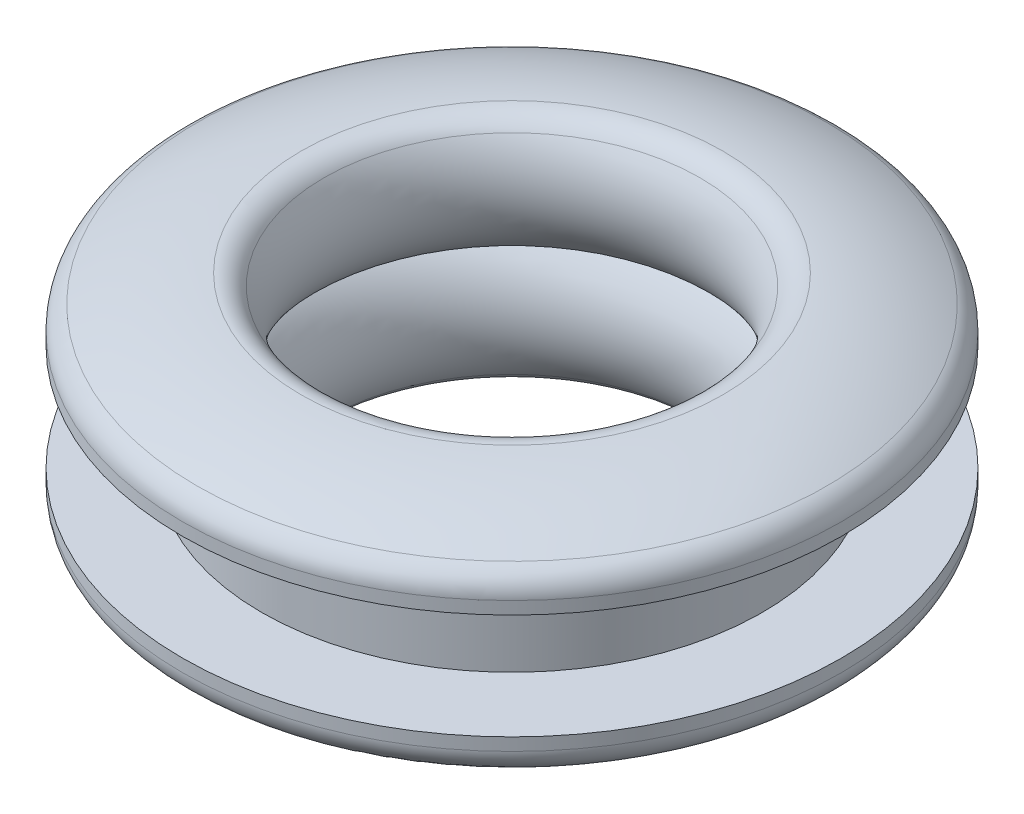
ISO-10303-21;
HEADER;
FILE_DESCRIPTION(('STEP AP214'),'2;1');
FILE_NAME('part.step','',(''),(''),'','','');
FILE_SCHEMA(('AUTOMOTIVE_DESIGN { 1 0 10303 214 1 1 1 1 }'));
ENDSEC;
DATA;
#1=APPLICATION_CONTEXT('core data for automotive mechanical design processes');
#2=APPLICATION_PROTOCOL_DEFINITION('international standard','automotive_design',2000,#1);
#3=PRODUCT_CONTEXT('',#1,'mechanical');
#4=PRODUCT('Part','Part','',(#3));
#5=PRODUCT_RELATED_PRODUCT_CATEGORY('part','',(#4));
#6=PRODUCT_DEFINITION_FORMATION('','',#4);
#7=PRODUCT_DEFINITION_CONTEXT('part definition',#1,'design');
#8=PRODUCT_DEFINITION('design','',#6,#7);
#9=PRODUCT_DEFINITION_SHAPE('','',#8);
#10=(LENGTH_UNIT() NAMED_UNIT(*) SI_UNIT(.MILLI.,.METRE.));
#11=(NAMED_UNIT(*) PLANE_ANGLE_UNIT() SI_UNIT($,.RADIAN.));
#12=(NAMED_UNIT(*) SI_UNIT($,.STERADIAN.) SOLID_ANGLE_UNIT());
#13=UNCERTAINTY_MEASURE_WITH_UNIT(LENGTH_MEASURE(1.E-05),#10,'distance_accuracy_value','');
#14=(GEOMETRIC_REPRESENTATION_CONTEXT(3) GLOBAL_UNCERTAINTY_ASSIGNED_CONTEXT((#13)) GLOBAL_UNIT_ASSIGNED_CONTEXT((#10,
#11,#12)) REPRESENTATION_CONTEXT('',''));
#15=CARTESIAN_POINT('',(0.,0.,0.));
#16=DIRECTION('',(0.,0.,1.));
#17=DIRECTION('',(1.,0.,0.));
#18=AXIS2_PLACEMENT_3D('',#15,#16,#17);
#19=CARTESIAN_POINT('',(-75.,-22.0833333333334,0.));
#20=DIRECTION('',(0.,1.,0.));
#21=DIRECTION('',(0.,0.,1.));
#22=AXIS2_PLACEMENT_3D('',#19,#20,#21);
#23=TOROIDAL_SURFACE('',#22,97.0833333333334,31.230549502406);
#24=CARTESIAN_POINT('',(-75.,-39.6890180135923,0.));
#25=DIRECTION('',(0.,1.,0.));
#26=DIRECTION('',(0.,0.,1.));
#27=AXIS2_PLACEMENT_3D('',#24,#25,#26);
#28=CIRCLE('',#27,71.2882351718313);
#29=CARTESIAN_POINT('',(-75.,-39.6890180135923,71.2882351718313));
#30=VERTEX_POINT('',#29);
#31=EDGE_CURVE('E50',#30,#30,#28,.F.);
#32=ORIENTED_EDGE('',*,*,#31,.T.);
#33=EDGE_LOOP('',(#32));
#34=FACE_BOUND('',#33,.T.);
#35=CARTESIAN_POINT('',(-75.,0.,0.));
#36=DIRECTION('',(0.,1.,0.));
#37=DIRECTION('',(0.,0.,1.));
#38=AXIS2_PLACEMENT_3D('',#35,#36,#37);
#39=CIRCLE('',#38,75.);
#40=CARTESIAN_POINT('',(-75.,0.,75.));
#41=VERTEX_POINT('',#40);
#42=EDGE_CURVE('E93',#41,#41,#39,.T.);
#43=ORIENTED_EDGE('',*,*,#42,.T.);
#44=EDGE_LOOP('',(#43));
#45=FACE_BOUND('',#44,.T.);
#46=ADVANCED_FACE('F37',(#34,#45),#23,.T.);
#47=CARTESIAN_POINT('',(-75.,55.8333333333332,0.));
#48=DIRECTION('',(0.,1.,0.));
#49=DIRECTION('',(0.,0.,1.));
#50=AXIS2_PLACEMENT_3D('',#47,#48,#49);
#51=DEGENERATE_TOROIDAL_SURFACE('',#50,75.,100.,.T.);
#52=CARTESIAN_POINT('',(-75.,-44.0389149851273,0.));
#53=DIRECTION('',(0.,1.,0.));
#54=DIRECTION('',(0.,0.,1.));
#55=AXIS2_PLACEMENT_3D('',#52,#53,#54);
#56=CIRCLE('',#55,80.0531194142546);
#57=CARTESIAN_POINT('',(-75.,-44.0389149851273,80.0531194142546));
#58=VERTEX_POINT('',#57);
#59=EDGE_CURVE('E55',#58,#58,#56,.T.);
#60=ORIENTED_EDGE('',*,*,#59,.T.);
#61=EDGE_LOOP('',(#60));
#62=FACE_BOUND('',#61,.T.);
#63=CARTESIAN_POINT('',(-75.,-33.7473083144284,0.));
#64=DIRECTION('',(0.,1.,0.));
#65=DIRECTION('',(0.,0.,1.));
#66=AXIS2_PLACEMENT_3D('',#63,#64,#65);
#67=CIRCLE('',#66,119.444444444444);
#68=CARTESIAN_POINT('',(-75.,-33.7473083144284,119.444444444444));
#69=VERTEX_POINT('',#68);
#70=EDGE_CURVE('E61',#69,#69,#67,.T.);
#71=ORIENTED_EDGE('',*,*,#70,.F.);
#72=EDGE_LOOP('',(#71));
#73=FACE_BOUND('',#72,.T.);
#74=ADVANCED_FACE('F114',(#62,#73),#51,.T.);
#75=CARTESIAN_POINT('',(-75.,-24.7892441496523,0.));
#76=DIRECTION('',(0.,1.,0.));
#77=DIRECTION('',(0.,0.,1.));
#78=AXIS2_PLACEMENT_3D('',#75,#76,#77);
#79=TOROIDAL_SURFACE('',#78,115.,10.);
#80=CARTESIAN_POINT('',(-75.,-24.7892441496523,0.));
#81=DIRECTION('',(0.,1.,0.));
#82=DIRECTION('',(0.,0.,1.));
#83=AXIS2_PLACEMENT_3D('',#80,#81,#82);
#84=CIRCLE('',#83,125.);
#85=CARTESIAN_POINT('',(-75.,-24.7892441496523,125.));
#86=VERTEX_POINT('',#85);
#87=EDGE_CURVE('E65',#86,#86,#84,.T.);
#88=ORIENTED_EDGE('',*,*,#87,.F.);
#89=EDGE_LOOP('',(#88));
#90=FACE_BOUND('',#89,.T.);
#91=ORIENTED_EDGE('',*,*,#70,.T.);
#92=EDGE_LOOP('',(#91));
#93=FACE_BOUND('',#92,.T.);
#94=ADVANCED_FACE('F120',(#90,#93),#79,.T.);
#95=CARTESIAN_POINT('',(-75.,0.,0.));
#96=DIRECTION('',(0.,1.,0.));
#97=DIRECTION('',(0.,0.,1.));
#98=AXIS2_PLACEMENT_3D('',#95,#96,#97);
#99=CYLINDRICAL_SURFACE('',#98,125.);
#100=CARTESIAN_POINT('',(-75.,-20.,0.));
#101=DIRECTION('',(0.,1.,0.));
#102=DIRECTION('',(0.,0.,1.));
#103=AXIS2_PLACEMENT_3D('',#100,#101,#102);
#104=CIRCLE('',#103,125.);
#105=CARTESIAN_POINT('',(-75.,-20.,125.));
#106=VERTEX_POINT('',#105);
#107=EDGE_CURVE('E69',#106,#106,#104,.T.);
#108=ORIENTED_EDGE('',*,*,#107,.F.);
#109=EDGE_LOOP('',(#108));
#110=FACE_BOUND('',#109,.T.);
#111=ORIENTED_EDGE('',*,*,#87,.T.);
#112=EDGE_LOOP('',(#111));
#113=FACE_BOUND('',#112,.T.);
#114=ADVANCED_FACE('F143',(#110,#113),#99,.T.);
#115=CARTESIAN_POINT('',(50.,-20.,0.));
#116=DIRECTION('',(0.,-1.,0.));
#117=DIRECTION('',(0.,0.,-1.));
#118=AXIS2_PLACEMENT_3D('',#115,#116,#117);
#119=PLANE('',#118);
#120=CARTESIAN_POINT('',(-75.,-20.,0.));
#121=DIRECTION('',(0.,1.,0.));
#122=DIRECTION('',(0.,0.,1.));
#123=AXIS2_PLACEMENT_3D('',#120,#121,#122);
#124=CIRCLE('',#123,95.);
#125=CARTESIAN_POINT('',(-75.,-20.,95.));
#126=VERTEX_POINT('',#125);
#127=EDGE_CURVE('E73',#126,#126,#124,.T.);
#128=ORIENTED_EDGE('',*,*,#127,.F.);
#129=EDGE_LOOP('',(#128));
#130=FACE_BOUND('',#129,.T.);
#131=ORIENTED_EDGE('',*,*,#107,.T.);
#132=EDGE_LOOP('',(#131));
#133=FACE_BOUND('',#132,.T.);
#134=ADVANCED_FACE('F110',(#130,#133),#119,.F.);
#135=CARTESIAN_POINT('',(-75.,0.,0.));
#136=DIRECTION('',(0.,1.,0.));
#137=DIRECTION('',(0.,0.,1.));
#138=AXIS2_PLACEMENT_3D('',#135,#136,#137);
#139=CYLINDRICAL_SURFACE('',#138,95.);
#140=ORIENTED_EDGE('',*,*,#127,.T.);
#141=EDGE_LOOP('',(#140));
#142=FACE_BOUND('',#141,.T.);
#143=CARTESIAN_POINT('',(-75.,20.,0.));
#144=DIRECTION('',(0.,1.,0.));
#145=DIRECTION('',(0.,0.,1.));
#146=AXIS2_PLACEMENT_3D('',#143,#144,#145);
#147=CIRCLE('',#146,95.);
#148=CARTESIAN_POINT('',(-75.,20.,95.));
#149=VERTEX_POINT('',#148);
#150=EDGE_CURVE('E89',#149,#149,#147,.T.);
#151=ORIENTED_EDGE('',*,*,#150,.F.);
#152=EDGE_LOOP('',(#151));
#153=FACE_BOUND('',#152,.T.);
#154=ADVANCED_FACE('F102',(#142,#153),#139,.T.);
#155=CARTESIAN_POINT('',(-75.,22.0833333333334,0.));
#156=DIRECTION('',(0.,-1.,0.));
#157=DIRECTION('',(0.,0.,1.));
#158=AXIS2_PLACEMENT_3D('',#155,#156,#157);
#159=TOROIDAL_SURFACE('',#158,97.0833333333334,31.230549502406);
#160=CARTESIAN_POINT('',(-75.,39.6890180135923,0.));
#161=DIRECTION('',(0.,-1.,0.));
#162=DIRECTION('',(0.,0.,-1.));
#163=AXIS2_PLACEMENT_3D('',#160,#161,#162);
#164=CIRCLE('',#163,71.2882351718313);
#165=CARTESIAN_POINT('',(-75.,39.6890180135923,-71.2882351718313));
#166=VERTEX_POINT('',#165);
#167=EDGE_CURVE('E45',#166,#166,#164,.F.);
#168=ORIENTED_EDGE('',*,*,#167,.T.);
#169=EDGE_LOOP('',(#168));
#170=FACE_BOUND('',#169,.T.);
#171=ORIENTED_EDGE('',*,*,#42,.F.);
#172=EDGE_LOOP('',(#171));
#173=FACE_BOUND('',#172,.T.);
#174=ADVANCED_FACE('F99',(#170,#173),#159,.T.);
#175=CARTESIAN_POINT('',(-75.,-55.8333333333332,0.));
#176=DIRECTION('',(0.,-1.,0.));
#177=DIRECTION('',(0.,0.,1.));
#178=AXIS2_PLACEMENT_3D('',#175,#176,#177);
#179=DEGENERATE_TOROIDAL_SURFACE('',#178,75.,100.,.T.);
#180=CARTESIAN_POINT('',(-75.,44.0389149851273,0.));
#181=DIRECTION('',(0.,-1.,0.));
#182=DIRECTION('',(0.,0.,-1.));
#183=AXIS2_PLACEMENT_3D('',#180,#181,#182);
#184=CIRCLE('',#183,80.0531194142546);
#185=CARTESIAN_POINT('',(-75.,44.0389149851273,-80.0531194142546));
#186=VERTEX_POINT('',#185);
#187=EDGE_CURVE('E10',#186,#186,#184,.T.);
#188=ORIENTED_EDGE('',*,*,#187,.T.);
#189=EDGE_LOOP('',(#188));
#190=FACE_BOUND('',#189,.T.);
#191=CARTESIAN_POINT('',(-75.,33.7473083144284,0.));
#192=DIRECTION('',(0.,1.,0.));
#193=DIRECTION('',(0.,0.,1.));
#194=AXIS2_PLACEMENT_3D('',#191,#192,#193);
#195=CIRCLE('',#194,119.444444444444);
#196=CARTESIAN_POINT('',(-75.,33.7473083144284,119.444444444444));
#197=VERTEX_POINT('',#196);
#198=EDGE_CURVE('E77',#197,#197,#195,.T.);
#199=ORIENTED_EDGE('',*,*,#198,.T.);
#200=EDGE_LOOP('',(#199));
#201=FACE_BOUND('',#200,.T.);
#202=ADVANCED_FACE('F101',(#190,#201),#179,.T.);
#203=CARTESIAN_POINT('',(-75.,24.7892441496523,0.));
#204=DIRECTION('',(0.,-1.,0.));
#205=DIRECTION('',(0.,0.,1.));
#206=AXIS2_PLACEMENT_3D('',#203,#204,#205);
#207=TOROIDAL_SURFACE('',#206,115.,10.);
#208=CARTESIAN_POINT('',(-75.,24.7892441496523,0.));
#209=DIRECTION('',(0.,1.,0.));
#210=DIRECTION('',(0.,0.,1.));
#211=AXIS2_PLACEMENT_3D('',#208,#209,#210);
#212=CIRCLE('',#211,125.);
#213=CARTESIAN_POINT('',(-75.,24.7892441496523,125.));
#214=VERTEX_POINT('',#213);
#215=EDGE_CURVE('E81',#214,#214,#212,.T.);
#216=ORIENTED_EDGE('',*,*,#215,.T.);
#217=EDGE_LOOP('',(#216));
#218=FACE_BOUND('',#217,.T.);
#219=ORIENTED_EDGE('',*,*,#198,.F.);
#220=EDGE_LOOP('',(#219));
#221=FACE_BOUND('',#220,.T.);
#222=ADVANCED_FACE('F108',(#218,#221),#207,.T.);
#223=CARTESIAN_POINT('',(-75.,0.,0.));
#224=DIRECTION('',(0.,-1.,0.));
#225=DIRECTION('',(0.,0.,1.));
#226=AXIS2_PLACEMENT_3D('',#223,#224,#225);
#227=CYLINDRICAL_SURFACE('',#226,125.);
#228=CARTESIAN_POINT('',(-75.,20.,0.));
#229=DIRECTION('',(0.,1.,0.));
#230=DIRECTION('',(0.,0.,1.));
#231=AXIS2_PLACEMENT_3D('',#228,#229,#230);
#232=CIRCLE('',#231,125.);
#233=CARTESIAN_POINT('',(-75.,20.,125.));
#234=VERTEX_POINT('',#233);
#235=EDGE_CURVE('E85',#234,#234,#232,.T.);
#236=ORIENTED_EDGE('',*,*,#235,.T.);
#237=EDGE_LOOP('',(#236));
#238=FACE_BOUND('',#237,.T.);
#239=ORIENTED_EDGE('',*,*,#215,.F.);
#240=EDGE_LOOP('',(#239));
#241=FACE_BOUND('',#240,.T.);
#242=ADVANCED_FACE('F133',(#238,#241),#227,.T.);
#243=CARTESIAN_POINT('',(50.,20.,0.));
#244=DIRECTION('',(0.,1.,0.));
#245=DIRECTION('',(0.,0.,-1.));
#246=AXIS2_PLACEMENT_3D('',#243,#244,#245);
#247=PLANE('',#246);
#248=ORIENTED_EDGE('',*,*,#150,.T.);
#249=EDGE_LOOP('',(#248));
#250=FACE_BOUND('',#249,.T.);
#251=ORIENTED_EDGE('',*,*,#235,.F.);
#252=EDGE_LOOP('',(#251));
#253=FACE_BOUND('',#252,.T.);
#254=ADVANCED_FACE('F126',(#250,#253),#247,.F.);
#255=CARTESIAN_POINT('',(-75.,-34.0516901532859,0.));
#256=DIRECTION('',(0.,-1.,0.));
#257=DIRECTION('',(0.,0.,-1.));
#258=AXIS2_PLACEMENT_3D('',#255,#256,#257);
#259=TOROIDAL_SURFACE('',#258,79.5478074728294,10.);
#260=ORIENTED_EDGE('',*,*,#31,.F.);
#261=EDGE_LOOP('',(#260));
#262=FACE_BOUND('',#261,.T.);
#263=ORIENTED_EDGE('',*,*,#59,.F.);
#264=EDGE_LOOP('',(#263));
#265=FACE_BOUND('',#264,.T.);
#266=ADVANCED_FACE('F124',(#262,#265),#259,.T.);
#267=CARTESIAN_POINT('',(-75.,34.0516901532859,0.));
#268=DIRECTION('',(0.,-1.,0.));
#269=DIRECTION('',(0.,0.,-1.));
#270=AXIS2_PLACEMENT_3D('',#267,#268,#269);
#271=TOROIDAL_SURFACE('',#270,79.5478074728294,10.);
#272=ORIENTED_EDGE('',*,*,#187,.F.);
#273=EDGE_LOOP('',(#272));
#274=FACE_BOUND('',#273,.T.);
#275=ORIENTED_EDGE('',*,*,#167,.F.);
#276=EDGE_LOOP('',(#275));
#277=FACE_BOUND('',#276,.T.);
#278=ADVANCED_FACE('F39',(#274,#277),#271,.T.);
#279=CLOSED_SHELL('',(#46,#74,#94,#114,#134,#154,#174,#202,#222,#242,#254,#266,#278));
#280=MANIFOLD_SOLID_BREP('B2',#279);
#281=ADVANCED_BREP_SHAPE_REPRESENTATION('',(#18,#280),#14);
#282=SHAPE_DEFINITION_REPRESENTATION(#9,#281);
ENDSEC;
END-ISO-10303-21;
